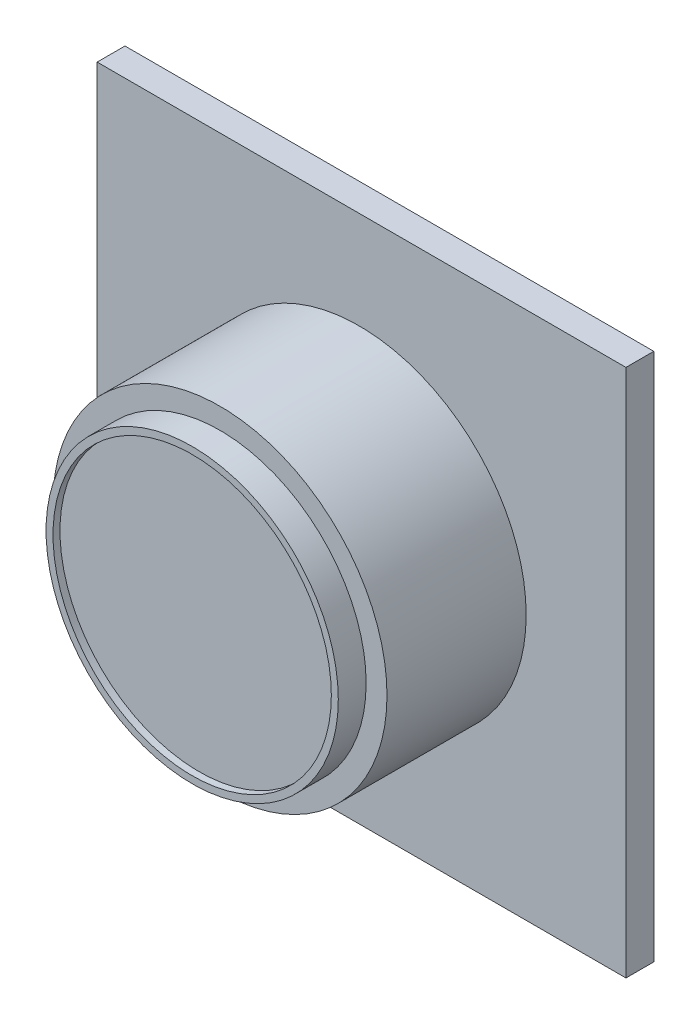
ISO-10303-21;
HEADER;
FILE_DESCRIPTION(('STEP AP214'),'2;1');
FILE_NAME('part.step','',(''),(''),'','','');
FILE_SCHEMA(('AUTOMOTIVE_DESIGN { 1 0 10303 214 1 1 1 1 }'));
ENDSEC;
DATA;
#1=APPLICATION_CONTEXT('core data for automotive mechanical design processes');
#2=APPLICATION_PROTOCOL_DEFINITION('international standard','automotive_design',2000,#1);
#3=PRODUCT_CONTEXT('',#1,'mechanical');
#4=PRODUCT('Part','Part','',(#3));
#5=PRODUCT_RELATED_PRODUCT_CATEGORY('part','',(#4));
#6=PRODUCT_DEFINITION_FORMATION('','',#4);
#7=PRODUCT_DEFINITION_CONTEXT('part definition',#1,'design');
#8=PRODUCT_DEFINITION('design','',#6,#7);
#9=PRODUCT_DEFINITION_SHAPE('','',#8);
#10=(LENGTH_UNIT() NAMED_UNIT(*) SI_UNIT(.MILLI.,.METRE.));
#11=(NAMED_UNIT(*) PLANE_ANGLE_UNIT() SI_UNIT($,.RADIAN.));
#12=(NAMED_UNIT(*) SI_UNIT($,.STERADIAN.) SOLID_ANGLE_UNIT());
#13=UNCERTAINTY_MEASURE_WITH_UNIT(LENGTH_MEASURE(1.E-05),#10,'distance_accuracy_value','');
#14=(GEOMETRIC_REPRESENTATION_CONTEXT(3) GLOBAL_UNCERTAINTY_ASSIGNED_CONTEXT((#13)) GLOBAL_UNIT_ASSIGNED_CONTEXT((#10,
#11,#12)) REPRESENTATION_CONTEXT('',''));
#15=CARTESIAN_POINT('',(0.,0.,0.));
#16=DIRECTION('',(0.,0.,1.));
#17=DIRECTION('',(1.,0.,0.));
#18=AXIS2_PLACEMENT_3D('',#15,#16,#17);
#19=CARTESIAN_POINT('',(0.,0.,7.));
#20=DIRECTION('',(0.,0.,-1.));
#21=DIRECTION('',(-1.,0.,0.));
#22=AXIS2_PLACEMENT_3D('',#19,#20,#21);
#23=CYLINDRICAL_SURFACE('',#22,5.);
#24=CARTESIAN_POINT('',(0.,0.,0.));
#25=DIRECTION('',(0.,0.,1.));
#26=DIRECTION('',(1.,0.,0.));
#27=AXIS2_PLACEMENT_3D('',#24,#25,#26);
#28=CIRCLE('',#27,5.);
#29=CARTESIAN_POINT('',(5.,0.,0.));
#30=VERTEX_POINT('',#29);
#31=EDGE_CURVE('E131',#30,#30,#28,.T.);
#32=ORIENTED_EDGE('',*,*,#31,.F.);
#33=EDGE_LOOP('',(#32));
#34=FACE_BOUND('',#33,.T.);
#35=CARTESIAN_POINT('',(0.,0.,6.));
#36=DIRECTION('',(0.,0.,1.));
#37=DIRECTION('',(1.,0.,0.));
#38=AXIS2_PLACEMENT_3D('',#35,#36,#37);
#39=CIRCLE('',#38,5.);
#40=CARTESIAN_POINT('',(5.,0.,6.));
#41=VERTEX_POINT('',#40);
#42=EDGE_CURVE('E128',#41,#41,#39,.T.);
#43=ORIENTED_EDGE('',*,*,#42,.T.);
#44=EDGE_LOOP('',(#43));
#45=FACE_BOUND('',#44,.T.);
#46=ADVANCED_FACE('F39',(#34,#45),#23,.F.);
#47=CARTESIAN_POINT('',(-9.41441441441442,9.5,1.));
#48=DIRECTION('',(1.,0.,0.));
#49=DIRECTION('',(0.,0.,-1.));
#50=AXIS2_PLACEMENT_3D('',#47,#48,#49);
#51=PLANE('',#50);
#52=DIRECTION('',(0.,-1.,0.));
#53=VECTOR('',#52,1.);
#54=CARTESIAN_POINT('',(-9.41441441441442,9.5,0.));
#55=LINE('',#54,#53);
#56=CARTESIAN_POINT('',(-9.41441441441442,9.5,0.));
#57=VERTEX_POINT('',#56);
#58=CARTESIAN_POINT('',(-9.41441441441442,-9.5,0.));
#59=VERTEX_POINT('',#58);
#60=EDGE_CURVE('E112',#57,#59,#55,.T.);
#61=ORIENTED_EDGE('',*,*,#60,.T.);
#62=DIRECTION('',(0.,0.,-1.));
#63=VECTOR('',#62,1.);
#64=CARTESIAN_POINT('',(-9.41441441441442,-9.5,1.));
#65=LINE('',#64,#63);
#66=CARTESIAN_POINT('',(-9.41441441441442,-9.5,1.));
#67=VERTEX_POINT('',#66);
#68=EDGE_CURVE('E101',#67,#59,#65,.T.);
#69=ORIENTED_EDGE('',*,*,#68,.F.);
#70=DIRECTION('',(0.,-1.,0.));
#71=VECTOR('',#70,1.);
#72=CARTESIAN_POINT('',(-9.41441441441442,9.5,1.));
#73=LINE('',#72,#71);
#74=CARTESIAN_POINT('',(-9.41441441441442,9.5,1.));
#75=VERTEX_POINT('',#74);
#76=EDGE_CURVE('E93',#75,#67,#73,.T.);
#77=ORIENTED_EDGE('',*,*,#76,.F.);
#78=DIRECTION('',(0.,0.,-1.));
#79=VECTOR('',#78,1.);
#80=CARTESIAN_POINT('',(-9.41441441441442,9.5,1.));
#81=LINE('',#80,#79);
#82=EDGE_CURVE('E108',#75,#57,#81,.T.);
#83=ORIENTED_EDGE('',*,*,#82,.T.);
#84=EDGE_LOOP('',(#61,#69,#77,#83));
#85=FACE_BOUND('',#84,.T.);
#86=ADVANCED_FACE('F41',(#85),#51,.F.);
#87=CARTESIAN_POINT('',(-9.41441441441442,-9.5,1.));
#88=DIRECTION('',(0.,1.,0.));
#89=DIRECTION('',(0.,0.,1.));
#90=AXIS2_PLACEMENT_3D('',#87,#88,#89);
#91=PLANE('',#90);
#92=DIRECTION('',(1.,0.,0.));
#93=VECTOR('',#92,1.);
#94=CARTESIAN_POINT('',(-9.41441441441442,-9.5,0.));
#95=LINE('',#94,#93);
#96=CARTESIAN_POINT('',(9.58558558558558,-9.5,0.));
#97=VERTEX_POINT('',#96);
#98=EDGE_CURVE('E99',#59,#97,#95,.T.);
#99=ORIENTED_EDGE('',*,*,#98,.T.);
#100=DIRECTION('',(0.,0.,-1.));
#101=VECTOR('',#100,1.);
#102=CARTESIAN_POINT('',(9.58558558558558,-9.5,1.));
#103=LINE('',#102,#101);
#104=CARTESIAN_POINT('',(9.58558558558558,-9.5,1.));
#105=VERTEX_POINT('',#104);
#106=EDGE_CURVE('E97',#105,#97,#103,.T.);
#107=ORIENTED_EDGE('',*,*,#106,.F.);
#108=DIRECTION('',(1.,0.,0.));
#109=VECTOR('',#108,1.);
#110=CARTESIAN_POINT('',(-9.41441441441442,-9.5,1.));
#111=LINE('',#110,#109);
#112=EDGE_CURVE('E88',#67,#105,#111,.T.);
#113=ORIENTED_EDGE('',*,*,#112,.F.);
#114=ORIENTED_EDGE('',*,*,#68,.T.);
#115=EDGE_LOOP('',(#99,#107,#113,#114));
#116=FACE_BOUND('',#115,.T.);
#117=ADVANCED_FACE('F98',(#116),#91,.F.);
#118=CARTESIAN_POINT('',(9.58558558558558,9.5,1.));
#119=DIRECTION('',(-1.,0.,0.));
#120=DIRECTION('',(0.,0.,1.));
#121=AXIS2_PLACEMENT_3D('',#118,#119,#120);
#122=PLANE('',#121);
#123=DIRECTION('',(0.,1.,0.));
#124=VECTOR('',#123,1.);
#125=CARTESIAN_POINT('',(9.58558558558558,9.5,0.));
#126=LINE('',#125,#124);
#127=CARTESIAN_POINT('',(9.58558558558558,9.5,0.));
#128=VERTEX_POINT('',#127);
#129=EDGE_CURVE('E74',#97,#128,#126,.T.);
#130=ORIENTED_EDGE('',*,*,#129,.T.);
#131=DIRECTION('',(0.,0.,-1.));
#132=VECTOR('',#131,1.);
#133=CARTESIAN_POINT('',(9.58558558558558,9.5,1.));
#134=LINE('',#133,#132);
#135=CARTESIAN_POINT('',(9.58558558558558,9.5,1.));
#136=VERTEX_POINT('',#135);
#137=EDGE_CURVE('E102',#136,#128,#134,.T.);
#138=ORIENTED_EDGE('',*,*,#137,.F.);
#139=DIRECTION('',(0.,1.,0.));
#140=VECTOR('',#139,1.);
#141=CARTESIAN_POINT('',(9.58558558558558,9.5,1.));
#142=LINE('',#141,#140);
#143=EDGE_CURVE('E91',#105,#136,#142,.T.);
#144=ORIENTED_EDGE('',*,*,#143,.F.);
#145=ORIENTED_EDGE('',*,*,#106,.T.);
#146=EDGE_LOOP('',(#130,#138,#144,#145));
#147=FACE_BOUND('',#146,.T.);
#148=ADVANCED_FACE('F104',(#147),#122,.F.);
#149=CARTESIAN_POINT('',(-9.41441441441442,9.5,1.));
#150=DIRECTION('',(0.,-1.,0.));
#151=DIRECTION('',(0.,0.,-1.));
#152=AXIS2_PLACEMENT_3D('',#149,#150,#151);
#153=PLANE('',#152);
#154=DIRECTION('',(-1.,0.,0.));
#155=VECTOR('',#154,1.);
#156=CARTESIAN_POINT('',(-9.41441441441442,9.5,0.));
#157=LINE('',#156,#155);
#158=EDGE_CURVE('E80',#128,#57,#157,.T.);
#159=ORIENTED_EDGE('',*,*,#158,.T.);
#160=ORIENTED_EDGE('',*,*,#82,.F.);
#161=DIRECTION('',(-1.,0.,0.));
#162=VECTOR('',#161,1.);
#163=CARTESIAN_POINT('',(-9.41441441441442,9.5,1.));
#164=LINE('',#163,#162);
#165=EDGE_CURVE('E57',#136,#75,#164,.T.);
#166=ORIENTED_EDGE('',*,*,#165,.F.);
#167=ORIENTED_EDGE('',*,*,#137,.T.);
#168=EDGE_LOOP('',(#159,#160,#166,#167));
#169=FACE_BOUND('',#168,.T.);
#170=ADVANCED_FACE('F164',(#169),#153,.F.);
#171=CARTESIAN_POINT('',(0.,0.,1.));
#172=DIRECTION('',(0.,0.,1.));
#173=DIRECTION('',(1.,0.,0.));
#174=AXIS2_PLACEMENT_3D('',#171,#172,#173);
#175=PLANE('',#174);
#176=CARTESIAN_POINT('',(0.,0.,1.));
#177=DIRECTION('',(0.,0.,1.));
#178=DIRECTION('',(1.,0.,0.));
#179=AXIS2_PLACEMENT_3D('',#176,#177,#178);
#180=CIRCLE('',#179,6.);
#181=CARTESIAN_POINT('',(6.,0.,1.));
#182=VERTEX_POINT('',#181);
#183=EDGE_CURVE('E49',#182,#182,#180,.T.);
#184=ORIENTED_EDGE('',*,*,#183,.F.);
#185=EDGE_LOOP('',(#184));
#186=FACE_BOUND('',#185,.T.);
#187=ORIENTED_EDGE('',*,*,#76,.T.);
#188=ORIENTED_EDGE('',*,*,#112,.T.);
#189=ORIENTED_EDGE('',*,*,#143,.T.);
#190=ORIENTED_EDGE('',*,*,#165,.T.);
#191=EDGE_LOOP('',(#187,#188,#189,#190));
#192=FACE_BOUND('',#191,.T.);
#193=ADVANCED_FACE('F89',(#186,#192),#175,.T.);
#194=CARTESIAN_POINT('',(0.,0.,0.));
#195=DIRECTION('',(0.,0.,1.));
#196=DIRECTION('',(1.,0.,0.));
#197=AXIS2_PLACEMENT_3D('',#194,#195,#196);
#198=PLANE('',#197);
#199=ORIENTED_EDGE('',*,*,#31,.T.);
#200=EDGE_LOOP('',(#199));
#201=FACE_BOUND('',#200,.T.);
#202=ORIENTED_EDGE('',*,*,#60,.F.);
#203=ORIENTED_EDGE('',*,*,#158,.F.);
#204=ORIENTED_EDGE('',*,*,#129,.F.);
#205=ORIENTED_EDGE('',*,*,#98,.F.);
#206=EDGE_LOOP('',(#202,#203,#204,#205));
#207=FACE_BOUND('',#206,.T.);
#208=ADVANCED_FACE('F163',(#201,#207),#198,.F.);
#209=CARTESIAN_POINT('',(0.,0.,6.));
#210=DIRECTION('',(0.,0.,-1.));
#211=DIRECTION('',(-1.,0.,0.));
#212=AXIS2_PLACEMENT_3D('',#209,#210,#211);
#213=CYLINDRICAL_SURFACE('',#212,6.);
#214=CARTESIAN_POINT('',(0.,0.,6.));
#215=DIRECTION('',(0.,0.,1.));
#216=DIRECTION('',(1.,0.,0.));
#217=AXIS2_PLACEMENT_3D('',#214,#215,#216);
#218=CIRCLE('',#217,6.);
#219=CARTESIAN_POINT('',(6.,0.,6.));
#220=VERTEX_POINT('',#219);
#221=EDGE_CURVE('E116',#220,#220,#218,.T.);
#222=ORIENTED_EDGE('',*,*,#221,.F.);
#223=EDGE_LOOP('',(#222));
#224=FACE_BOUND('',#223,.T.);
#225=ORIENTED_EDGE('',*,*,#183,.T.);
#226=EDGE_LOOP('',(#225));
#227=FACE_BOUND('',#226,.T.);
#228=ADVANCED_FACE('F160',(#224,#227),#213,.T.);
#229=CARTESIAN_POINT('',(0.,0.,6.));
#230=DIRECTION('',(0.,0.,1.));
#231=DIRECTION('',(1.,0.,0.));
#232=AXIS2_PLACEMENT_3D('',#229,#230,#231);
#233=PLANE('',#232);
#234=CARTESIAN_POINT('',(0.,0.,6.));
#235=DIRECTION('',(0.,0.,1.));
#236=DIRECTION('',(1.,0.,0.));
#237=AXIS2_PLACEMENT_3D('',#234,#235,#236);
#238=CIRCLE('',#237,5.25);
#239=CARTESIAN_POINT('',(5.25,0.,6.));
#240=VERTEX_POINT('',#239);
#241=EDGE_CURVE('E142',#240,#240,#238,.T.);
#242=ORIENTED_EDGE('',*,*,#241,.F.);
#243=EDGE_LOOP('',(#242));
#244=FACE_BOUND('',#243,.T.);
#245=ORIENTED_EDGE('',*,*,#221,.T.);
#246=EDGE_LOOP('',(#245));
#247=FACE_BOUND('',#246,.T.);
#248=ADVANCED_FACE('F201',(#244,#247),#233,.T.);
#249=CARTESIAN_POINT('',(0.,0.,7.));
#250=DIRECTION('',(0.,0.,1.));
#251=DIRECTION('',(1.,0.,0.));
#252=AXIS2_PLACEMENT_3D('',#249,#250,#251);
#253=PLANE('',#252);
#254=CARTESIAN_POINT('',(0.,0.,7.));
#255=DIRECTION('',(0.,0.,1.));
#256=DIRECTION('',(1.,0.,0.));
#257=AXIS2_PLACEMENT_3D('',#254,#255,#256);
#258=CIRCLE('',#257,5.25);
#259=CARTESIAN_POINT('',(5.25,0.,7.));
#260=VERTEX_POINT('',#259);
#261=EDGE_CURVE('E145',#260,#260,#258,.T.);
#262=ORIENTED_EDGE('',*,*,#261,.T.);
#263=EDGE_LOOP('',(#262));
#264=FACE_BOUND('',#263,.T.);
#265=CARTESIAN_POINT('',(0.,0.,7.));
#266=DIRECTION('',(0.,0.,1.));
#267=DIRECTION('',(1.,0.,0.));
#268=AXIS2_PLACEMENT_3D('',#265,#266,#267);
#269=CIRCLE('',#268,5.);
#270=CARTESIAN_POINT('',(5.,0.,7.));
#271=VERTEX_POINT('',#270);
#272=EDGE_CURVE('E136',#271,#271,#269,.T.);
#273=ORIENTED_EDGE('',*,*,#272,.F.);
#274=EDGE_LOOP('',(#273));
#275=FACE_BOUND('',#274,.T.);
#276=ADVANCED_FACE('F193',(#264,#275),#253,.T.);
#277=CARTESIAN_POINT('',(0.,0.,7.));
#278=DIRECTION('',(0.,0.,-1.));
#279=DIRECTION('',(-1.,0.,0.));
#280=AXIS2_PLACEMENT_3D('',#277,#278,#279);
#281=CYLINDRICAL_SURFACE('',#280,5.25);
#282=ORIENTED_EDGE('',*,*,#261,.F.);
#283=EDGE_LOOP('',(#282));
#284=FACE_BOUND('',#283,.T.);
#285=ORIENTED_EDGE('',*,*,#241,.T.);
#286=EDGE_LOOP('',(#285));
#287=FACE_BOUND('',#286,.T.);
#288=ADVANCED_FACE('F185',(#284,#287),#281,.T.);
#289=CARTESIAN_POINT('',(0.,0.,6.75));
#290=DIRECTION('',(0.,0.,1.));
#291=DIRECTION('',(1.,0.,0.));
#292=AXIS2_PLACEMENT_3D('',#289,#290,#291);
#293=CIRCLE('',#292,5.);
#294=CARTESIAN_POINT('',(5.,0.,6.75));
#295=VERTEX_POINT('',#294);
#296=EDGE_CURVE('E11',#295,#295,#293,.T.);
#297=ORIENTED_EDGE('',*,*,#296,.F.);
#298=EDGE_LOOP('',(#297));
#299=FACE_BOUND('',#298,.T.);
#300=ORIENTED_EDGE('',*,*,#272,.T.);
#301=EDGE_LOOP('',(#300));
#302=FACE_BOUND('',#301,.T.);
#303=ADVANCED_FACE('F176',(#299,#302),#23,.F.);
#304=CARTESIAN_POINT('',(0.,0.,6.));
#305=DIRECTION('',(0.,0.,1.));
#306=DIRECTION('',(1.,0.,0.));
#307=AXIS2_PLACEMENT_3D('',#304,#305,#306);
#308=PLANE('',#307);
#309=ORIENTED_EDGE('',*,*,#42,.F.);
#310=EDGE_LOOP('',(#309));
#311=FACE_BOUND('',#310,.T.);
#312=ADVANCED_FACE('F184',(#311),#308,.F.);
#313=CARTESIAN_POINT('',(0.,0.,6.75));
#314=DIRECTION('',(0.,0.,1.));
#315=DIRECTION('',(1.,0.,0.));
#316=AXIS2_PLACEMENT_3D('',#313,#314,#315);
#317=PLANE('',#316);
#318=ORIENTED_EDGE('',*,*,#296,.T.);
#319=EDGE_LOOP('',(#318));
#320=FACE_BOUND('',#319,.T.);
#321=ADVANCED_FACE('F191',(#320),#317,.T.);
#322=CLOSED_SHELL('',(#46,#86,#117,#148,#170,#193,#208,#228,#248,#276,#288,#303,#312,#321));
#323=MANIFOLD_SOLID_BREP('B2',#322);
#324=ADVANCED_BREP_SHAPE_REPRESENTATION('',(#18,#323),#14);
#325=SHAPE_DEFINITION_REPRESENTATION(#9,#324);
ENDSEC;
END-ISO-10303-21;
